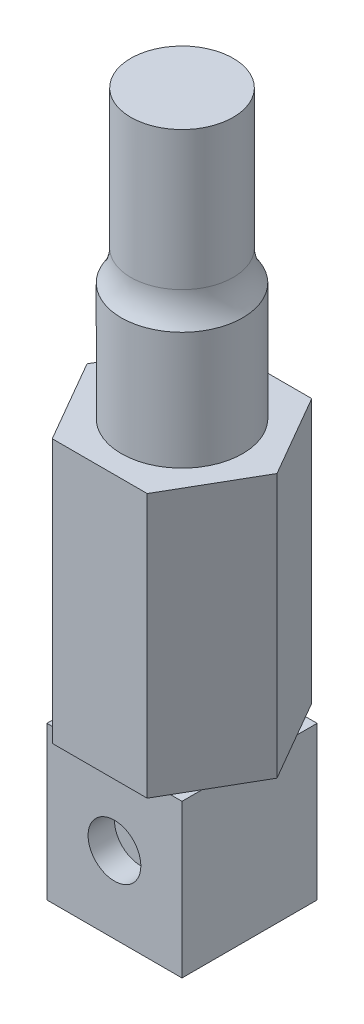
ISO-10303-21;
HEADER;
FILE_DESCRIPTION(('STEP AP214'),'2;1');
FILE_NAME('part.step','',(''),(''),'','','');
FILE_SCHEMA(('AUTOMOTIVE_DESIGN { 1 0 10303 214 1 1 1 1 }'));
ENDSEC;
DATA;
#1=APPLICATION_CONTEXT('core data for automotive mechanical design processes');
#2=APPLICATION_PROTOCOL_DEFINITION('international standard','automotive_design',2000,#1);
#3=PRODUCT_CONTEXT('',#1,'mechanical');
#4=PRODUCT('Part','Part','',(#3));
#5=PRODUCT_RELATED_PRODUCT_CATEGORY('part','',(#4));
#6=PRODUCT_DEFINITION_FORMATION('','',#4);
#7=PRODUCT_DEFINITION_CONTEXT('part definition',#1,'design');
#8=PRODUCT_DEFINITION('design','',#6,#7);
#9=PRODUCT_DEFINITION_SHAPE('','',#8);
#10=(LENGTH_UNIT() NAMED_UNIT(*) SI_UNIT(.MILLI.,.METRE.));
#11=(NAMED_UNIT(*) PLANE_ANGLE_UNIT() SI_UNIT($,.RADIAN.));
#12=(NAMED_UNIT(*) SI_UNIT($,.STERADIAN.) SOLID_ANGLE_UNIT());
#13=UNCERTAINTY_MEASURE_WITH_UNIT(LENGTH_MEASURE(1.E-05),#10,'distance_accuracy_value','');
#14=(GEOMETRIC_REPRESENTATION_CONTEXT(3) GLOBAL_UNCERTAINTY_ASSIGNED_CONTEXT((#13)) GLOBAL_UNIT_ASSIGNED_CONTEXT((#10,
#11,#12)) REPRESENTATION_CONTEXT('',''));
#15=CARTESIAN_POINT('',(0.,0.,0.));
#16=DIRECTION('',(0.,0.,1.));
#17=DIRECTION('',(1.,0.,0.));
#18=AXIS2_PLACEMENT_3D('',#15,#16,#17);
#19=CARTESIAN_POINT('',(0.,3.683,0.));
#20=DIRECTION('',(0.,-1.,0.));
#21=DIRECTION('',(0.,0.,-1.));
#22=AXIS2_PLACEMENT_3D('',#19,#20,#21);
#23=PLANE('',#22);
#24=DIRECTION('',(-0.499999999999999,0.,0.866025403784439));
#25=VECTOR('',#24,1.);
#26=CARTESIAN_POINT('',(-4.572,3.683,0.));
#27=LINE('',#26,#25);
#28=CARTESIAN_POINT('',(-2.69491880481069,3.683,-3.2512));
#29=VERTEX_POINT('',#28);
#30=CARTESIAN_POINT('',(-3.2512,3.683,-2.28769270663698));
#31=VERTEX_POINT('',#30);
#32=EDGE_CURVE('E367',#29,#31,#27,.T.);
#33=ORIENTED_EDGE('',*,*,#32,.F.);
#34=DIRECTION('',(-1.,0.,0.));
#35=VECTOR('',#34,1.);
#36=CARTESIAN_POINT('',(-3.2512,3.683,-3.2512));
#37=LINE('',#36,#35);
#38=CARTESIAN_POINT('',(-3.2512,3.683,-3.2512));
#39=VERTEX_POINT('',#38);
#40=EDGE_CURVE('E203',#29,#39,#37,.T.);
#41=ORIENTED_EDGE('',*,*,#40,.T.);
#42=DIRECTION('',(0.,0.,1.));
#43=VECTOR('',#42,1.);
#44=CARTESIAN_POINT('',(-3.2512,3.683,3.2512));
#45=LINE('',#44,#43);
#46=EDGE_CURVE('E212',#39,#31,#45,.T.);
#47=ORIENTED_EDGE('',*,*,#46,.T.);
#48=EDGE_LOOP('',(#33,#41,#47));
#49=FACE_BOUND('',#48,.T.);
#50=ADVANCED_FACE('F44',(#49),#23,.F.);
#51=DIRECTION('',(-0.5,0.,-0.866025403784439));
#52=VECTOR('',#51,1.);
#53=CARTESIAN_POINT('',(2.286,3.683,-3.95946814610245));
#54=LINE('',#53,#52);
#55=CARTESIAN_POINT('',(3.2512,3.683,-2.28769270663697));
#56=VERTEX_POINT('',#55);
#57=CARTESIAN_POINT('',(2.69491880481069,3.683,-3.2512));
#58=VERTEX_POINT('',#57);
#59=EDGE_CURVE('E351',#56,#58,#54,.T.);
#60=ORIENTED_EDGE('',*,*,#59,.F.);
#61=DIRECTION('',(0.,0.,-1.));
#62=VECTOR('',#61,1.);
#63=CARTESIAN_POINT('',(3.2512,3.683,3.2512));
#64=LINE('',#63,#62);
#65=CARTESIAN_POINT('',(3.2512,3.683,-3.2512));
#66=VERTEX_POINT('',#65);
#67=EDGE_CURVE('E205',#56,#66,#64,.T.);
#68=ORIENTED_EDGE('',*,*,#67,.T.);
#69=EDGE_CURVE('E206',#66,#58,#37,.T.);
#70=ORIENTED_EDGE('',*,*,#69,.T.);
#71=EDGE_LOOP('',(#60,#68,#70));
#72=FACE_BOUND('',#71,.T.);
#73=ADVANCED_FACE('F313',(#72),#23,.F.);
#74=DIRECTION('',(0.5,0.,-0.866025403784439));
#75=VECTOR('',#74,1.);
#76=CARTESIAN_POINT('',(4.572,3.683,0.));
#77=LINE('',#76,#75);
#78=CARTESIAN_POINT('',(2.69491880481069,3.683,3.2512));
#79=VERTEX_POINT('',#78);
#80=CARTESIAN_POINT('',(3.2512,3.683,2.28769270663698));
#81=VERTEX_POINT('',#80);
#82=EDGE_CURVE('E67',#79,#81,#77,.T.);
#83=ORIENTED_EDGE('',*,*,#82,.F.);
#84=DIRECTION('',(1.,0.,0.));
#85=VECTOR('',#84,1.);
#86=CARTESIAN_POINT('',(-3.2512,3.683,3.2512));
#87=LINE('',#86,#85);
#88=CARTESIAN_POINT('',(3.2512,3.683,3.2512));
#89=VERTEX_POINT('',#88);
#90=EDGE_CURVE('E216',#79,#89,#87,.T.);
#91=ORIENTED_EDGE('',*,*,#90,.T.);
#92=EDGE_CURVE('E200',#89,#81,#64,.T.);
#93=ORIENTED_EDGE('',*,*,#92,.T.);
#94=EDGE_LOOP('',(#83,#91,#93));
#95=FACE_BOUND('',#94,.T.);
#96=ADVANCED_FACE('F336',(#95),#23,.F.);
#97=DIRECTION('',(0.5,0.,0.866025403784438));
#98=VECTOR('',#97,1.);
#99=CARTESIAN_POINT('',(-2.286,3.683,3.95946814610246));
#100=LINE('',#99,#98);
#101=CARTESIAN_POINT('',(-3.2512,3.683,2.28769270663697));
#102=VERTEX_POINT('',#101);
#103=CARTESIAN_POINT('',(-2.69491880481069,3.683,3.2512));
#104=VERTEX_POINT('',#103);
#105=EDGE_CURVE('E75',#102,#104,#100,.T.);
#106=ORIENTED_EDGE('',*,*,#105,.F.);
#107=CARTESIAN_POINT('',(-3.2512,3.683,3.2512));
#108=VERTEX_POINT('',#107);
#109=EDGE_CURVE('E210',#102,#108,#45,.T.);
#110=ORIENTED_EDGE('',*,*,#109,.T.);
#111=EDGE_CURVE('E218',#108,#104,#87,.T.);
#112=ORIENTED_EDGE('',*,*,#111,.T.);
#113=EDGE_LOOP('',(#106,#110,#112));
#114=FACE_BOUND('',#113,.T.);
#115=ADVANCED_FACE('F315',(#114),#23,.F.);
#116=CARTESIAN_POINT('',(3.2512,3.683,3.2512));
#117=DIRECTION('',(-1.,0.,0.));
#118=DIRECTION('',(0.,0.,1.));
#119=AXIS2_PLACEMENT_3D('',#116,#117,#118);
#120=PLANE('',#119);
#121=DIRECTION('',(0.,0.,-1.));
#122=VECTOR('',#121,1.);
#123=CARTESIAN_POINT('',(3.2512,-3.683,3.2512));
#124=LINE('',#123,#122);
#125=CARTESIAN_POINT('',(3.2512,-3.683,3.2512));
#126=VERTEX_POINT('',#125);
#127=CARTESIAN_POINT('',(3.2512,-3.683,-3.2512));
#128=VERTEX_POINT('',#127);
#129=EDGE_CURVE('E198',#126,#128,#124,.T.);
#130=ORIENTED_EDGE('',*,*,#129,.T.);
#131=DIRECTION('',(0.,-1.,0.));
#132=VECTOR('',#131,1.);
#133=CARTESIAN_POINT('',(3.2512,3.683,-3.2512));
#134=LINE('',#133,#132);
#135=EDGE_CURVE('E246',#66,#128,#134,.T.);
#136=ORIENTED_EDGE('',*,*,#135,.F.);
#137=ORIENTED_EDGE('',*,*,#67,.F.);
#138=EDGE_CURVE('E204',#81,#56,#64,.T.);
#139=ORIENTED_EDGE('',*,*,#138,.F.);
#140=ORIENTED_EDGE('',*,*,#92,.F.);
#141=DIRECTION('',(0.,-1.,0.));
#142=VECTOR('',#141,1.);
#143=CARTESIAN_POINT('',(3.2512,3.683,3.2512));
#144=LINE('',#143,#142);
#145=EDGE_CURVE('E221',#89,#126,#144,.T.);
#146=ORIENTED_EDGE('',*,*,#145,.T.);
#147=EDGE_LOOP('',(#130,#136,#137,#139,#140,#146));
#148=FACE_BOUND('',#147,.T.);
#149=ADVANCED_FACE('F329',(#148),#120,.F.);
#150=CARTESIAN_POINT('',(-3.2512,3.683,-3.2512));
#151=DIRECTION('',(0.,0.,1.));
#152=DIRECTION('',(1.,0.,0.));
#153=AXIS2_PLACEMENT_3D('',#150,#151,#152);
#154=PLANE('',#153);
#155=DIRECTION('',(-1.,0.,0.));
#156=VECTOR('',#155,1.);
#157=CARTESIAN_POINT('',(-3.2512,-3.683,-3.2512));
#158=LINE('',#157,#156);
#159=CARTESIAN_POINT('',(-3.2512,-3.683,-3.2512));
#160=VERTEX_POINT('',#159);
#161=EDGE_CURVE('E226',#128,#160,#158,.T.);
#162=ORIENTED_EDGE('',*,*,#161,.T.);
#163=DIRECTION('',(0.,-1.,0.));
#164=VECTOR('',#163,1.);
#165=CARTESIAN_POINT('',(-3.2512,3.683,-3.2512));
#166=LINE('',#165,#164);
#167=EDGE_CURVE('E242',#39,#160,#166,.T.);
#168=ORIENTED_EDGE('',*,*,#167,.F.);
#169=ORIENTED_EDGE('',*,*,#40,.F.);
#170=EDGE_CURVE('E211',#58,#29,#37,.T.);
#171=ORIENTED_EDGE('',*,*,#170,.F.);
#172=ORIENTED_EDGE('',*,*,#69,.F.);
#173=ORIENTED_EDGE('',*,*,#135,.T.);
#174=EDGE_LOOP('',(#162,#168,#169,#171,#172,#173));
#175=FACE_BOUND('',#174,.T.);
#176=ADVANCED_FACE('F326',(#175),#154,.F.);
#177=CARTESIAN_POINT('',(-3.2512,3.683,3.2512));
#178=DIRECTION('',(1.,0.,0.));
#179=DIRECTION('',(0.,0.,-1.));
#180=AXIS2_PLACEMENT_3D('',#177,#178,#179);
#181=PLANE('',#180);
#182=DIRECTION('',(0.,0.,1.));
#183=VECTOR('',#182,1.);
#184=CARTESIAN_POINT('',(-3.2512,-3.683,3.2512));
#185=LINE('',#184,#183);
#186=CARTESIAN_POINT('',(-3.2512,-3.683,3.2512));
#187=VERTEX_POINT('',#186);
#188=EDGE_CURVE('E229',#160,#187,#185,.T.);
#189=ORIENTED_EDGE('',*,*,#188,.T.);
#190=DIRECTION('',(0.,-1.,0.));
#191=VECTOR('',#190,1.);
#192=CARTESIAN_POINT('',(-3.2512,3.683,3.2512));
#193=LINE('',#192,#191);
#194=EDGE_CURVE('E238',#108,#187,#193,.T.);
#195=ORIENTED_EDGE('',*,*,#194,.F.);
#196=ORIENTED_EDGE('',*,*,#109,.F.);
#197=EDGE_CURVE('E217',#31,#102,#45,.T.);
#198=ORIENTED_EDGE('',*,*,#197,.F.);
#199=ORIENTED_EDGE('',*,*,#46,.F.);
#200=ORIENTED_EDGE('',*,*,#167,.T.);
#201=EDGE_LOOP('',(#189,#195,#196,#198,#199,#200));
#202=FACE_BOUND('',#201,.T.);
#203=ADVANCED_FACE('F322',(#202),#181,.F.);
#204=CARTESIAN_POINT('',(-3.2512,3.683,3.2512));
#205=DIRECTION('',(0.,0.,-1.));
#206=DIRECTION('',(-1.,0.,0.));
#207=AXIS2_PLACEMENT_3D('',#204,#205,#206);
#208=PLANE('',#207);
#209=CARTESIAN_POINT('',(0.,0.,3.2512));
#210=DIRECTION('',(0.,0.,1.));
#211=DIRECTION('',(1.,0.,0.));
#212=AXIS2_PLACEMENT_3D('',#209,#210,#211);
#213=CIRCLE('',#212,1.27);
#214=CARTESIAN_POINT('',(1.27,0.,3.2512));
#215=VERTEX_POINT('',#214);
#216=EDGE_CURVE('E185',#215,#215,#213,.T.);
#217=ORIENTED_EDGE('',*,*,#216,.F.);
#218=EDGE_LOOP('',(#217));
#219=FACE_BOUND('',#218,.T.);
#220=DIRECTION('',(1.,0.,0.));
#221=VECTOR('',#220,1.);
#222=CARTESIAN_POINT('',(-3.2512,-3.683,3.2512));
#223=LINE('',#222,#221);
#224=EDGE_CURVE('E232',#187,#126,#223,.T.);
#225=ORIENTED_EDGE('',*,*,#224,.T.);
#226=ORIENTED_EDGE('',*,*,#145,.F.);
#227=ORIENTED_EDGE('',*,*,#90,.F.);
#228=EDGE_CURVE('E222',#104,#79,#87,.T.);
#229=ORIENTED_EDGE('',*,*,#228,.F.);
#230=ORIENTED_EDGE('',*,*,#111,.F.);
#231=ORIENTED_EDGE('',*,*,#194,.T.);
#232=EDGE_LOOP('',(#225,#226,#227,#229,#230,#231));
#233=FACE_BOUND('',#232,.T.);
#234=ADVANCED_FACE('F318',(#219,#233),#208,.F.);
#235=CARTESIAN_POINT('',(0.,-3.683,0.));
#236=DIRECTION('',(0.,-1.,0.));
#237=DIRECTION('',(0.,0.,-1.));
#238=AXIS2_PLACEMENT_3D('',#235,#236,#237);
#239=PLANE('',#238);
#240=ORIENTED_EDGE('',*,*,#129,.F.);
#241=ORIENTED_EDGE('',*,*,#224,.F.);
#242=ORIENTED_EDGE('',*,*,#188,.F.);
#243=ORIENTED_EDGE('',*,*,#161,.F.);
#244=EDGE_LOOP('',(#240,#241,#242,#243));
#245=FACE_BOUND('',#244,.T.);
#246=ADVANCED_FACE('F309',(#245),#239,.T.);
#247=CARTESIAN_POINT('',(0.,0.,1.9812));
#248=DIRECTION('',(0.,0.,1.));
#249=DIRECTION('',(1.,0.,0.));
#250=AXIS2_PLACEMENT_3D('',#247,#248,#249);
#251=CYLINDRICAL_SURFACE('',#250,1.27);
#252=CARTESIAN_POINT('',(0.,0.,1.9812));
#253=DIRECTION('',(0.,0.,1.));
#254=DIRECTION('',(1.,0.,0.));
#255=AXIS2_PLACEMENT_3D('',#252,#253,#254);
#256=CIRCLE('',#255,1.27);
#257=CARTESIAN_POINT('',(1.27,0.,1.9812));
#258=VERTEX_POINT('',#257);
#259=EDGE_CURVE('E190',#258,#258,#256,.T.);
#260=ORIENTED_EDGE('',*,*,#259,.F.);
#261=EDGE_LOOP('',(#260));
#262=FACE_BOUND('',#261,.T.);
#263=ORIENTED_EDGE('',*,*,#216,.T.);
#264=EDGE_LOOP('',(#263));
#265=FACE_BOUND('',#264,.T.);
#266=ADVANCED_FACE('F305',(#262,#265),#251,.F.);
#267=CARTESIAN_POINT('',(0.,0.,1.9812));
#268=DIRECTION('',(0.,0.,1.));
#269=DIRECTION('',(1.,0.,0.));
#270=AXIS2_PLACEMENT_3D('',#267,#268,#269);
#271=PLANE('',#270);
#272=ORIENTED_EDGE('',*,*,#259,.T.);
#273=EDGE_LOOP('',(#272));
#274=FACE_BOUND('',#273,.T.);
#275=ADVANCED_FACE('F302',(#274),#271,.T.);
#276=CARTESIAN_POINT('',(0.,3.683,0.));
#277=DIRECTION('',(0.,-1.,0.));
#278=DIRECTION('',(0.,0.,-1.));
#279=AXIS2_PLACEMENT_3D('',#276,#277,#278);
#280=PLANE('',#279);
#281=CARTESIAN_POINT('',(4.572,3.683,0.));
#282=VERTEX_POINT('',#281);
#283=EDGE_CURVE('E373',#81,#282,#77,.T.);
#284=ORIENTED_EDGE('',*,*,#283,.F.);
#285=ORIENTED_EDGE('',*,*,#138,.T.);
#286=EDGE_CURVE('E360',#282,#56,#54,.T.);
#287=ORIENTED_EDGE('',*,*,#286,.F.);
#288=EDGE_LOOP('',(#284,#285,#287));
#289=FACE_BOUND('',#288,.T.);
#290=ADVANCED_FACE('F281',(#289),#280,.T.);
#291=CARTESIAN_POINT('',(2.286,3.683,-3.95946814610245));
#292=VERTEX_POINT('',#291);
#293=EDGE_CURVE('E354',#58,#292,#54,.T.);
#294=ORIENTED_EDGE('',*,*,#293,.F.);
#295=ORIENTED_EDGE('',*,*,#170,.T.);
#296=CARTESIAN_POINT('',(-2.286,3.683,-3.95946814610245));
#297=VERTEX_POINT('',#296);
#298=EDGE_CURVE('E371',#297,#29,#27,.T.);
#299=ORIENTED_EDGE('',*,*,#298,.F.);
#300=DIRECTION('',(-1.,0.,0.));
#301=VECTOR('',#300,1.);
#302=CARTESIAN_POINT('',(-2.286,3.683,-3.95946814610245));
#303=LINE('',#302,#301);
#304=EDGE_CURVE('E176',#292,#297,#303,.T.);
#305=ORIENTED_EDGE('',*,*,#304,.F.);
#306=EDGE_LOOP('',(#294,#295,#299,#305));
#307=FACE_BOUND('',#306,.T.);
#308=ADVANCED_FACE('F355',(#307),#280,.T.);
#309=CARTESIAN_POINT('',(-4.572,3.683,0.));
#310=VERTEX_POINT('',#309);
#311=EDGE_CURVE('E182',#31,#310,#27,.T.);
#312=ORIENTED_EDGE('',*,*,#311,.F.);
#313=ORIENTED_EDGE('',*,*,#197,.T.);
#314=EDGE_CURVE('E404',#310,#102,#100,.T.);
#315=ORIENTED_EDGE('',*,*,#314,.F.);
#316=EDGE_LOOP('',(#312,#313,#315));
#317=FACE_BOUND('',#316,.T.);
#318=ADVANCED_FACE('F282',(#317),#280,.T.);
#319=CARTESIAN_POINT('',(-4.572,16.383,0.));
#320=DIRECTION('',(0.866025403784439,0.,0.499999999999999));
#321=DIRECTION('',(0.499999999999999,0.,-0.866025403784439));
#322=AXIS2_PLACEMENT_3D('',#319,#320,#321);
#323=PLANE('',#322);
#324=ORIENTED_EDGE('',*,*,#298,.T.);
#325=ORIENTED_EDGE('',*,*,#32,.T.);
#326=ORIENTED_EDGE('',*,*,#311,.T.);
#327=DIRECTION('',(0.,-1.,0.));
#328=VECTOR('',#327,1.);
#329=CARTESIAN_POINT('',(-4.572,16.383,0.));
#330=LINE('',#329,#328);
#331=CARTESIAN_POINT('',(-4.572,16.383,0.));
#332=VERTEX_POINT('',#331);
#333=EDGE_CURVE('E159',#332,#310,#330,.T.);
#334=ORIENTED_EDGE('',*,*,#333,.F.);
#335=DIRECTION('',(-0.499999999999999,0.,0.866025403784439));
#336=VECTOR('',#335,1.);
#337=CARTESIAN_POINT('',(-4.572,16.383,0.));
#338=LINE('',#337,#336);
#339=CARTESIAN_POINT('',(-2.286,16.383,-3.95946814610245));
#340=VERTEX_POINT('',#339);
#341=EDGE_CURVE('E166',#340,#332,#338,.T.);
#342=ORIENTED_EDGE('',*,*,#341,.F.);
#343=DIRECTION('',(0.,-1.,0.));
#344=VECTOR('',#343,1.);
#345=CARTESIAN_POINT('',(-2.286,16.383,-3.95946814610245));
#346=LINE('',#345,#344);
#347=EDGE_CURVE('E378',#340,#297,#346,.T.);
#348=ORIENTED_EDGE('',*,*,#347,.T.);
#349=EDGE_LOOP('',(#324,#325,#326,#334,#342,#348));
#350=FACE_BOUND('',#349,.T.);
#351=ADVANCED_FACE('F179',(#350),#323,.F.);
#352=CARTESIAN_POINT('',(-2.286,16.383,3.95946814610246));
#353=DIRECTION('',(0.866025403784438,0.,-0.5));
#354=DIRECTION('',(-0.500000000000001,0.,-0.866025403784438));
#355=AXIS2_PLACEMENT_3D('',#352,#353,#354);
#356=PLANE('',#355);
#357=ORIENTED_EDGE('',*,*,#314,.T.);
#358=ORIENTED_EDGE('',*,*,#105,.T.);
#359=CARTESIAN_POINT('',(-2.286,3.683,3.95946814610246));
#360=VERTEX_POINT('',#359);
#361=EDGE_CURVE('E406',#104,#360,#100,.T.);
#362=ORIENTED_EDGE('',*,*,#361,.T.);
#363=DIRECTION('',(0.,-1.,0.));
#364=VECTOR('',#363,1.);
#365=CARTESIAN_POINT('',(-2.286,16.383,3.95946814610246));
#366=LINE('',#365,#364);
#367=CARTESIAN_POINT('',(-2.286,16.383,3.95946814610246));
#368=VERTEX_POINT('',#367);
#369=EDGE_CURVE('E161',#368,#360,#366,.T.);
#370=ORIENTED_EDGE('',*,*,#369,.F.);
#371=DIRECTION('',(0.5,0.,0.866025403784438));
#372=VECTOR('',#371,1.);
#373=CARTESIAN_POINT('',(-2.286,16.383,3.95946814610246));
#374=LINE('',#373,#372);
#375=EDGE_CURVE('E154',#332,#368,#374,.T.);
#376=ORIENTED_EDGE('',*,*,#375,.F.);
#377=ORIENTED_EDGE('',*,*,#333,.T.);
#378=EDGE_LOOP('',(#357,#358,#362,#370,#376,#377));
#379=FACE_BOUND('',#378,.T.);
#380=ADVANCED_FACE('F157',(#379),#356,.F.);
#381=CARTESIAN_POINT('',(2.286,16.383,3.95946814610245));
#382=DIRECTION('',(0.,0.,-1.));
#383=DIRECTION('',(-1.,0.,0.));
#384=AXIS2_PLACEMENT_3D('',#381,#382,#383);
#385=PLANE('',#384);
#386=DIRECTION('',(1.,0.,0.));
#387=VECTOR('',#386,1.);
#388=CARTESIAN_POINT('',(2.286,3.683,3.95946814610245));
#389=LINE('',#388,#387);
#390=CARTESIAN_POINT('',(2.286,3.683,3.95946814610245));
#391=VERTEX_POINT('',#390);
#392=EDGE_CURVE('E397',#360,#391,#389,.T.);
#393=ORIENTED_EDGE('',*,*,#392,.T.);
#394=DIRECTION('',(0.,-1.,0.));
#395=VECTOR('',#394,1.);
#396=CARTESIAN_POINT('',(2.286,16.383,3.95946814610245));
#397=LINE('',#396,#395);
#398=CARTESIAN_POINT('',(2.286,16.383,3.95946814610245));
#399=VERTEX_POINT('',#398);
#400=EDGE_CURVE('E192',#399,#391,#397,.T.);
#401=ORIENTED_EDGE('',*,*,#400,.F.);
#402=DIRECTION('',(1.,0.,0.));
#403=VECTOR('',#402,1.);
#404=CARTESIAN_POINT('',(2.286,16.383,3.95946814610245));
#405=LINE('',#404,#403);
#406=EDGE_CURVE('E165',#368,#399,#405,.T.);
#407=ORIENTED_EDGE('',*,*,#406,.F.);
#408=ORIENTED_EDGE('',*,*,#369,.T.);
#409=EDGE_LOOP('',(#393,#401,#407,#408));
#410=FACE_BOUND('',#409,.T.);
#411=ADVANCED_FACE('F293',(#410),#385,.F.);
#412=CARTESIAN_POINT('',(4.572,16.383,0.));
#413=DIRECTION('',(-0.866025403784439,0.,-0.5));
#414=DIRECTION('',(-0.5,0.,0.866025403784439));
#415=AXIS2_PLACEMENT_3D('',#412,#413,#414);
#416=PLANE('',#415);
#417=EDGE_CURVE('E361',#391,#79,#77,.T.);
#418=ORIENTED_EDGE('',*,*,#417,.T.);
#419=ORIENTED_EDGE('',*,*,#82,.T.);
#420=ORIENTED_EDGE('',*,*,#283,.T.);
#421=DIRECTION('',(0.,-1.,0.));
#422=VECTOR('',#421,1.);
#423=CARTESIAN_POINT('',(4.572,16.383,0.));
#424=LINE('',#423,#422);
#425=CARTESIAN_POINT('',(4.572,16.383,0.));
#426=VERTEX_POINT('',#425);
#427=EDGE_CURVE('E384',#426,#282,#424,.T.);
#428=ORIENTED_EDGE('',*,*,#427,.F.);
#429=DIRECTION('',(0.5,0.,-0.866025403784439));
#430=VECTOR('',#429,1.);
#431=CARTESIAN_POINT('',(4.572,16.383,0.));
#432=LINE('',#431,#430);
#433=EDGE_CURVE('E393',#399,#426,#432,.T.);
#434=ORIENTED_EDGE('',*,*,#433,.F.);
#435=ORIENTED_EDGE('',*,*,#400,.T.);
#436=EDGE_LOOP('',(#418,#419,#420,#428,#434,#435));
#437=FACE_BOUND('',#436,.T.);
#438=ADVANCED_FACE('F289',(#437),#416,.F.);
#439=CARTESIAN_POINT('',(2.286,16.383,-3.95946814610245));
#440=DIRECTION('',(-0.866025403784438,0.,0.5));
#441=DIRECTION('',(0.5,0.,0.866025403784439));
#442=AXIS2_PLACEMENT_3D('',#439,#440,#441);
#443=PLANE('',#442);
#444=ORIENTED_EDGE('',*,*,#286,.T.);
#445=ORIENTED_EDGE('',*,*,#59,.T.);
#446=ORIENTED_EDGE('',*,*,#293,.T.);
#447=DIRECTION('',(0.,-1.,0.));
#448=VECTOR('',#447,1.);
#449=CARTESIAN_POINT('',(2.286,16.383,-3.95946814610245));
#450=LINE('',#449,#448);
#451=CARTESIAN_POINT('',(2.286,16.383,-3.95946814610245));
#452=VERTEX_POINT('',#451);
#453=EDGE_CURVE('E381',#452,#292,#450,.T.);
#454=ORIENTED_EDGE('',*,*,#453,.F.);
#455=DIRECTION('',(-0.5,0.,-0.866025403784439));
#456=VECTOR('',#455,1.);
#457=CARTESIAN_POINT('',(2.286,16.383,-3.95946814610245));
#458=LINE('',#457,#456);
#459=EDGE_CURVE('E411',#426,#452,#458,.T.);
#460=ORIENTED_EDGE('',*,*,#459,.F.);
#461=ORIENTED_EDGE('',*,*,#427,.T.);
#462=EDGE_LOOP('',(#444,#445,#446,#454,#460,#461));
#463=FACE_BOUND('',#462,.T.);
#464=ADVANCED_FACE('F285',(#463),#443,.F.);
#465=CARTESIAN_POINT('',(-2.286,16.383,-3.95946814610245));
#466=DIRECTION('',(0.,0.,1.));
#467=DIRECTION('',(1.,0.,0.));
#468=AXIS2_PLACEMENT_3D('',#465,#466,#467);
#469=PLANE('',#468);
#470=ORIENTED_EDGE('',*,*,#304,.T.);
#471=ORIENTED_EDGE('',*,*,#347,.F.);
#472=DIRECTION('',(-1.,0.,0.));
#473=VECTOR('',#472,1.);
#474=CARTESIAN_POINT('',(-2.286,16.383,-3.95946814610245));
#475=LINE('',#474,#473);
#476=EDGE_CURVE('E171',#452,#340,#475,.T.);
#477=ORIENTED_EDGE('',*,*,#476,.F.);
#478=ORIENTED_EDGE('',*,*,#453,.T.);
#479=EDGE_LOOP('',(#470,#471,#477,#478));
#480=FACE_BOUND('',#479,.T.);
#481=ADVANCED_FACE('F276',(#480),#469,.F.);
#482=CARTESIAN_POINT('',(0.,16.383,0.));
#483=DIRECTION('',(0.,-1.,0.));
#484=DIRECTION('',(0.,0.,-1.));
#485=AXIS2_PLACEMENT_3D('',#482,#483,#484);
#486=PLANE('',#485);
#487=CARTESIAN_POINT('',(0.,16.383,0.));
#488=DIRECTION('',(0.,1.,0.));
#489=DIRECTION('',(0.,0.,1.));
#490=AXIS2_PLACEMENT_3D('',#487,#488,#489);
#491=CIRCLE('',#490,2.921);
#492=CARTESIAN_POINT('',(0.,16.383,2.921));
#493=VERTEX_POINT('',#492);
#494=EDGE_CURVE('E60',#493,#493,#491,.T.);
#495=ORIENTED_EDGE('',*,*,#494,.F.);
#496=EDGE_LOOP('',(#495));
#497=FACE_BOUND('',#496,.T.);
#498=ORIENTED_EDGE('',*,*,#341,.T.);
#499=ORIENTED_EDGE('',*,*,#375,.T.);
#500=ORIENTED_EDGE('',*,*,#406,.T.);
#501=ORIENTED_EDGE('',*,*,#433,.T.);
#502=ORIENTED_EDGE('',*,*,#459,.T.);
#503=ORIENTED_EDGE('',*,*,#476,.T.);
#504=EDGE_LOOP('',(#498,#499,#500,#501,#502,#503));
#505=FACE_BOUND('',#504,.T.);
#506=ADVANCED_FACE('F169',(#497,#505),#486,.F.);
#507=ORIENTED_EDGE('',*,*,#361,.F.);
#508=ORIENTED_EDGE('',*,*,#228,.T.);
#509=ORIENTED_EDGE('',*,*,#417,.F.);
#510=ORIENTED_EDGE('',*,*,#392,.F.);
#511=EDGE_LOOP('',(#507,#508,#509,#510));
#512=FACE_BOUND('',#511,.T.);
#513=ADVANCED_FACE('F272',(#512),#280,.T.);
#514=CARTESIAN_POINT('',(0.,22.0472,0.));
#515=DIRECTION('',(0.,-1.,0.));
#516=DIRECTION('',(0.,0.,-1.));
#517=AXIS2_PLACEMENT_3D('',#514,#515,#516);
#518=CYLINDRICAL_SURFACE('',#517,2.921);
#519=CARTESIAN_POINT('',(0.,22.0472000000004,2.92100000000056));
#520=CARTESIAN_POINT('',(0.382358003335548,22.0472000000004,2.92100000000056));
#521=CARTESIAN_POINT('',(0.764565572565215,22.0472000000004,2.84497418757509));
#522=CARTESIAN_POINT('',(1.47107103931208,22.0472000000004,2.55233004135688));
#523=CARTESIAN_POINT('',(1.79509097084635,22.0472000000004,2.33582684484526));
#524=CARTESIAN_POINT('',(2.33582684484625,22.0472000000004,1.79509097084735));
#525=CARTESIAN_POINT('',(2.55233004135772,22.0472000000004,1.47107103931247));
#526=CARTESIAN_POINT('',(2.84497418757426,22.0472000000004,0.764565572564819));
#527=CARTESIAN_POINT('',(2.9210000000007,22.0472000000004,0.382358003335548));
#528=CARTESIAN_POINT('',(2.92100000000042,22.0472000000004,-0.382358003335548));
#529=CARTESIAN_POINT('',(2.84497418757426,22.0472000000004,-0.764565572564818));
#530=CARTESIAN_POINT('',(2.55233004135772,22.0472000000004,-1.47107103931246));
#531=CARTESIAN_POINT('',(2.33582684484541,22.0472000000004,-1.79509097084706));
#532=CARTESIAN_POINT('',(1.7950909708472,22.0472000000004,-2.33582684484555));
#533=CARTESIAN_POINT('',(1.47107103931241,22.0472000000004,-2.55233004135766));
#534=CARTESIAN_POINT('',(0.764565572564872,22.0472000000004,-2.84497418757432));
#535=CARTESIAN_POINT('',(0.382358003335894,22.0472000000004,-2.92100000000056));
#536=CARTESIAN_POINT('',(-0.382358003335894,22.0472000000004,-2.92100000000056));
#537=CARTESIAN_POINT('',(-0.764565572564872,22.0472000000004,-2.84497418757489));
#538=CARTESIAN_POINT('',(-1.47107103931241,22.0472000000004,-2.55233004135709));
#539=CARTESIAN_POINT('',(-1.79509097084663,22.0472000000004,-2.33582684484583));
#540=CARTESIAN_POINT('',(-2.33582684484597,22.0472000000004,-1.79509097084677));
#541=CARTESIAN_POINT('',(-2.55233004135772,22.0472000000004,-1.47107103931247));
#542=CARTESIAN_POINT('',(-2.84497418757426,22.0472000000004,-0.764565572564819));
#543=CARTESIAN_POINT('',(-2.92100000000056,22.0472000000004,-0.382358003335125));
#544=CARTESIAN_POINT('',(-2.92100000000056,22.0472000000004,0.382358003335121));
#545=CARTESIAN_POINT('',(-2.84497418757468,22.0472000000004,0.76456557256539));
#546=CARTESIAN_POINT('',(-2.55233004135729,22.0472000000004,1.4710710393119));
#547=CARTESIAN_POINT('',(-2.33582684484554,22.0472000000004,1.7950909708465));
#548=CARTESIAN_POINT('',(-1.79509097084707,22.0472000000004,2.33582684484611));
#549=CARTESIAN_POINT('',(-1.47107103931178,22.0472000000004,2.55233004135703));
#550=CARTESIAN_POINT('',(-0.764565572565491,22.0472000000004,2.84497418757495));
#551=CARTESIAN_POINT('',(-0.382358003335548,22.0472000000004,2.92100000000056));
#552=CARTESIAN_POINT('',(0.,22.0472000000004,2.92100000000056));
#553=(BOUNDED_CURVE() B_SPLINE_CURVE(3,(#519,#520,#521,#522,#523,#524,#525,#526,#527,#528,#529,
#530,#531,#532,#533,#534,#535,#536,#537,#538,#539,#540,#541,#542,#543,#544,#545,#546,#547,#548,
#549,#550,#551,#552),.UNSPECIFIED.,.T.,.F.) B_SPLINE_CURVE_WITH_KNOTS((4,2,2,2,2,2,2,2,2,2,2,2,
2,2,2,2,4),(-3.14159265358979,-2.74889357189107,-2.35619449019234,-1.96349540849362,
-1.5707963267949,-1.17809724509617,-0.785398163397448,-0.392699081698724,0.,0.392699081698724,
0.785398163397448,1.17809724509617,1.5707963267949,1.96349540849362,2.35619449019234,
2.74889357189107,3.14159265358979),
.UNSPECIFIED.) CURVE() GEOMETRIC_REPRESENTATION_ITEM() RATIONAL_B_SPLINE_CURVE((1.,1.,1.,1.,1.,
1.,1.,1.,1.,1.,1.,1.,1.,1.,1.,1.,1.,1.,1.,1.,1.,1.,1.,1.,1.,1.,1.,1.,1.,1.,1.,1.,1.,1.)) REPRESENTATION_ITEM(''));
#554=CARTESIAN_POINT('',(0.,22.0472000000004,2.92100000000056));
#555=VERTEX_POINT('',#554);
#556=EDGE_CURVE('E424',#555,#555,#553,.T.);
#557=ORIENTED_EDGE('',*,*,#556,.F.);
#558=EDGE_LOOP('',(#557));
#559=FACE_BOUND('',#558,.T.);
#560=ORIENTED_EDGE('',*,*,#494,.T.);
#561=EDGE_LOOP('',(#560));
#562=FACE_BOUND('',#561,.T.);
#563=ADVANCED_FACE('F268',(#559,#562),#518,.T.);
#564=CARTESIAN_POINT('',(0.,30.1752,0.));
#565=DIRECTION('',(0.,-1.,0.));
#566=DIRECTION('',(0.,0.,-1.));
#567=AXIS2_PLACEMENT_3D('',#564,#565,#566);
#568=CYLINDRICAL_SURFACE('',#567,2.4638);
#569=CARTESIAN_POINT('',(0.,23.5010033429606,2.4638));
#570=CARTESIAN_POINT('',(-0.322510663682965,23.5010033429606,2.4638));
#571=CARTESIAN_POINT('',(-0.644894439468077,23.5010033429618,2.39967387995373));
#572=CARTESIAN_POINT('',(-1.24081644185413,23.5010033429595,2.15283490444889));
#573=CARTESIAN_POINT('',(-1.51412021019219,23.5010033429618,1.97021916478264));
#574=CARTESIAN_POINT('',(-1.97021916478264,23.5010033429595,1.51412021019219));
#575=CARTESIAN_POINT('',(-2.15283490444885,23.5010033429606,1.24081644185423));
#576=CARTESIAN_POINT('',(-2.39967387995376,23.5010033429606,0.644894439467996));
#577=CARTESIAN_POINT('',(-2.4638,23.5010033429606,0.322510663682605));
#578=CARTESIAN_POINT('',(-2.4638,23.5010033429606,-0.322510663682609));
#579=CARTESIAN_POINT('',(-2.39967387995384,23.5010033429595,-0.6448944394678));
#580=CARTESIAN_POINT('',(-2.15283490444877,23.5010033429618,-1.24081644185441));
#581=CARTESIAN_POINT('',(-1.9702191647828,23.5010033429606,-1.51412021019203));
#582=CARTESIAN_POINT('',(-1.51412021019203,23.5010033429606,-1.9702191647828));
#583=CARTESIAN_POINT('',(-1.24081644185462,23.5010033429606,-2.15283490444869));
#584=CARTESIAN_POINT('',(-0.644894439467592,23.5010033429606,-2.39967387995393));
#585=CARTESIAN_POINT('',(-0.322510663683257,23.5010033429606,-2.4638));
#586=CARTESIAN_POINT('',(0.322510663683257,23.5010033429606,-2.4638));
#587=CARTESIAN_POINT('',(0.644894439467836,23.5010033429595,-2.39967387995383));
#588=CARTESIAN_POINT('',(1.24081644185438,23.5010033429618,-2.15283490444879));
#589=CARTESIAN_POINT('',(1.51412021019235,23.5010033429606,-1.97021916478248));
#590=CARTESIAN_POINT('',(1.97021916478248,23.5010033429606,-1.51412021019235));
#591=CARTESIAN_POINT('',(2.15283490444875,23.5010033429618,-1.24081644185448));
#592=CARTESIAN_POINT('',(2.39967387995387,23.5010033429595,-0.644894439467729));
#593=CARTESIAN_POINT('',(2.4638,23.5010033429606,-0.322510663682965));
#594=CARTESIAN_POINT('',(2.4638,23.5010033429606,0.322510663682965));
#595=CARTESIAN_POINT('',(2.39967387995384,23.5010033429595,0.644894439467801));
#596=CARTESIAN_POINT('',(2.15283490444877,23.5010033429618,1.24081644185442));
#597=CARTESIAN_POINT('',(1.97021916478267,23.5010033429618,1.51412021019216));
#598=CARTESIAN_POINT('',(1.51412021019216,23.5010033429595,1.97021916478267));
#599=CARTESIAN_POINT('',(1.24081644185434,23.5010033429595,2.1528349044488));
#600=CARTESIAN_POINT('',(0.644894439467883,23.5010033429618,2.39967387995381));
#601=CARTESIAN_POINT('',(0.322510663682966,23.5010033429606,2.4638));
#602=CARTESIAN_POINT('',(0.,23.5010033429606,2.4638));
#603=(BOUNDED_CURVE() B_SPLINE_CURVE(3,(#569,#570,#571,#572,#573,#574,#575,#576,#577,#578,#579,
#580,#581,#582,#583,#584,#585,#586,#587,#588,#589,#590,#591,#592,#593,#594,#595,#596,#597,#598,
#599,#600,#601,#602),.UNSPECIFIED.,.T.,.F.) B_SPLINE_CURVE_WITH_KNOTS((4,2,2,2,2,2,2,2,2,2,2,2,
2,2,2,2,4),(-3.14159265358979,-2.74889357189107,-2.35619449019234,-1.96349540849362,
-1.5707963267949,-1.17809724509617,-0.785398163397448,-0.392699081698724,0.,0.392699081698724,
0.785398163397448,1.17809724509617,1.5707963267949,1.96349540849362,2.35619449019234,
2.74889357189107,3.14159265358979),
.UNSPECIFIED.) CURVE() GEOMETRIC_REPRESENTATION_ITEM() RATIONAL_B_SPLINE_CURVE((1.,1.,1.,1.,1.,
1.,1.,1.,1.,1.,1.,1.,1.,1.,1.,1.,1.,1.,1.,1.,1.,1.,1.,1.,1.,1.,1.,1.,1.,1.,1.,1.,1.,1.)) REPRESENTATION_ITEM(''));
#604=CARTESIAN_POINT('',(0.,23.5010033429606,2.4638));
#605=VERTEX_POINT('',#604);
#606=EDGE_CURVE('E12',#605,#605,#603,.F.);
#607=ORIENTED_EDGE('',*,*,#606,.T.);
#608=EDGE_LOOP('',(#607));
#609=FACE_BOUND('',#608,.T.);
#610=CARTESIAN_POINT('',(0.,30.1752,0.));
#611=DIRECTION('',(0.,1.,0.));
#612=DIRECTION('',(0.,0.,1.));
#613=AXIS2_PLACEMENT_3D('',#610,#611,#612);
#614=CIRCLE('',#613,2.4638);
#615=CARTESIAN_POINT('',(0.,30.1752,2.4638));
#616=VERTEX_POINT('',#615);
#617=EDGE_CURVE('E421',#616,#616,#614,.T.);
#618=ORIENTED_EDGE('',*,*,#617,.F.);
#619=EDGE_LOOP('',(#618));
#620=FACE_BOUND('',#619,.T.);
#621=ADVANCED_FACE('F258',(#609,#620),#568,.T.);
#622=CARTESIAN_POINT('',(0.,30.1752,0.));
#623=DIRECTION('',(0.,1.,0.));
#624=DIRECTION('',(0.,0.,1.));
#625=AXIS2_PLACEMENT_3D('',#622,#623,#624);
#626=PLANE('',#625);
#627=ORIENTED_EDGE('',*,*,#617,.T.);
#628=EDGE_LOOP('',(#627));
#629=FACE_BOUND('',#628,.T.);
#630=ADVANCED_FACE('F267',(#629),#626,.T.);
#631=CARTESIAN_POINT('',(0.,22.0472000000004,2.92100000000056));
#632=CARTESIAN_POINT('',(-0.382358003335548,22.0472000000004,2.92100000000056));
#633=CARTESIAN_POINT('',(-0.764565572565491,22.0472000000004,2.84497418757495));
#634=CARTESIAN_POINT('',(-1.47107103931178,22.0472000000004,2.55233004135703));
#635=CARTESIAN_POINT('',(-1.79509097084707,22.0472000000004,2.33582684484611));
#636=CARTESIAN_POINT('',(-2.33582684484554,22.0472000000004,1.7950909708465));
#637=CARTESIAN_POINT('',(-2.55233004135729,22.0472000000004,1.4710710393119));
#638=CARTESIAN_POINT('',(-2.84497418757468,22.0472000000004,0.76456557256539));
#639=CARTESIAN_POINT('',(-2.92100000000056,22.0472000000004,0.382358003335121));
#640=CARTESIAN_POINT('',(-2.92100000000056,22.0472000000004,-0.382358003335125));
#641=CARTESIAN_POINT('',(-2.84497418757426,22.0472000000004,-0.764565572564819));
#642=CARTESIAN_POINT('',(-2.55233004135772,22.0472000000004,-1.47107103931247));
#643=CARTESIAN_POINT('',(-2.33582684484597,22.0472000000004,-1.79509097084677));
#644=CARTESIAN_POINT('',(-1.79509097084663,22.0472000000004,-2.33582684484583));
#645=CARTESIAN_POINT('',(-1.47107103931241,22.0472000000004,-2.55233004135709));
#646=CARTESIAN_POINT('',(-0.764565572564872,22.0472000000004,-2.84497418757489));
#647=CARTESIAN_POINT('',(-0.382358003335894,22.0472000000004,-2.92100000000056));
#648=CARTESIAN_POINT('',(0.382358003335894,22.0472000000004,-2.92100000000056));
#649=CARTESIAN_POINT('',(0.764565572564872,22.0472000000004,-2.84497418757432));
#650=CARTESIAN_POINT('',(1.47107103931241,22.0472000000004,-2.55233004135766));
#651=CARTESIAN_POINT('',(1.7950909708472,22.0472000000004,-2.33582684484555));
#652=CARTESIAN_POINT('',(2.33582684484541,22.0472000000004,-1.79509097084706));
#653=CARTESIAN_POINT('',(2.55233004135772,22.0472000000004,-1.47107103931246));
#654=CARTESIAN_POINT('',(2.84497418757426,22.0472000000004,-0.764565572564818));
#655=CARTESIAN_POINT('',(2.92100000000042,22.0472000000004,-0.382358003335548));
#656=CARTESIAN_POINT('',(2.9210000000007,22.0472000000004,0.382358003335548));
#657=CARTESIAN_POINT('',(2.84497418757426,22.0472000000004,0.764565572564819));
#658=CARTESIAN_POINT('',(2.55233004135772,22.0472000000004,1.47107103931247));
#659=CARTESIAN_POINT('',(2.33582684484625,22.0472000000004,1.79509097084735));
#660=CARTESIAN_POINT('',(1.79509097084635,22.0472000000004,2.33582684484526));
#661=CARTESIAN_POINT('',(1.47107103931208,22.0472000000004,2.55233004135688));
#662=CARTESIAN_POINT('',(0.764565572565215,22.0472000000004,2.84497418757509));
#663=CARTESIAN_POINT('',(0.382358003335548,22.0472000000004,2.92100000000056));
#664=CARTESIAN_POINT('',(0.,22.0472000000004,2.92100000000056));
#665=CARTESIAN_POINT('',(0.,22.702210297378,2.4638));
#666=CARTESIAN_POINT('',(-0.322510663682965,22.702210297378,2.4638));
#667=CARTESIAN_POINT('',(-0.644894439468146,22.702210297378,2.39967387995386));
#668=CARTESIAN_POINT('',(-1.24081644185406,22.702210297378,2.15283490444876));
#669=CARTESIAN_POINT('',(-1.51412021019223,22.702210297378,1.97021916478253));
#670=CARTESIAN_POINT('',(-1.9702191647826,22.702210297378,1.5141202101923));
#671=CARTESIAN_POINT('',(-2.15283490444833,22.702210297378,1.24081644185394));
#672=CARTESIAN_POINT('',(-2.39967387995428,22.702210297378,0.644894439468283));
#673=CARTESIAN_POINT('',(-2.4638,22.702210297378,0.322510663682605));
#674=CARTESIAN_POINT('',(-2.4638,22.702210297378,-0.322510663682609));
#675=CARTESIAN_POINT('',(-2.39967387995386,22.702210297378,-0.644894439467783));
#676=CARTESIAN_POINT('',(-2.15283490444876,22.702210297378,-1.24081644185443));
#677=CARTESIAN_POINT('',(-1.97021916478273,22.702210297378,-1.51412021019217));
#678=CARTESIAN_POINT('',(-1.5141202101921,22.702210297378,-1.97021916478266));
#679=CARTESIAN_POINT('',(-1.24081644185459,22.702210297378,-2.1528349044484));
#680=CARTESIAN_POINT('',(-0.644894439467628,22.702210297378,-2.39967387995421));
#681=CARTESIAN_POINT('',(-0.322510663683257,22.702210297378,-2.4638));
#682=CARTESIAN_POINT('',(0.322510663683257,22.702210297378,-2.4638));
#683=CARTESIAN_POINT('',(0.644894439467771,22.702210297378,-2.39967387995393));
#684=CARTESIAN_POINT('',(1.24081644185444,22.702210297378,-2.15283490444869));
#685=CARTESIAN_POINT('',(1.51412021019246,22.702210297378,-1.9702191647823));
#686=CARTESIAN_POINT('',(1.97021916478237,22.702210297378,-1.51412021019253));
#687=CARTESIAN_POINT('',(2.15283490444876,22.702210297378,-1.24081644185454));
#688=CARTESIAN_POINT('',(2.39967387995386,22.702210297378,-0.644894439467676));
#689=CARTESIAN_POINT('',(2.46380000000014,22.702210297378,-0.322510663682966));
#690=CARTESIAN_POINT('',(2.46379999999986,22.702210297378,0.322510663682965));
#691=CARTESIAN_POINT('',(2.39967387995386,22.702210297378,0.644894439467784));
#692=CARTESIAN_POINT('',(2.15283490444876,22.702210297378,1.24081644185443));
#693=CARTESIAN_POINT('',(1.97021916478253,22.702210297378,1.51412021019195));
#694=CARTESIAN_POINT('',(1.5141202101923,22.702210297378,1.97021916478289));
#695=CARTESIAN_POINT('',(1.24081644185421,22.702210297378,2.15283490444847));
#696=CARTESIAN_POINT('',(0.644894439468011,22.702210297378,2.39967387995414));
#697=CARTESIAN_POINT('',(0.322510663682966,22.702210297378,2.4638));
#698=CARTESIAN_POINT('',(0.,22.702210297378,2.4638));
#699=CARTESIAN_POINT('',(0.,23.5010033429606,2.4638));
#700=CARTESIAN_POINT('',(-0.322510663682965,23.5010033429606,2.4638));
#701=CARTESIAN_POINT('',(-0.644894439468077,23.5010033429618,2.39967387995373));
#702=CARTESIAN_POINT('',(-1.24081644185413,23.5010033429595,2.15283490444889));
#703=CARTESIAN_POINT('',(-1.51412021019219,23.5010033429618,1.97021916478264));
#704=CARTESIAN_POINT('',(-1.97021916478264,23.5010033429595,1.51412021019219));
#705=CARTESIAN_POINT('',(-2.15283490444885,23.5010033429606,1.24081644185423));
#706=CARTESIAN_POINT('',(-2.39967387995376,23.5010033429606,0.644894439467996));
#707=CARTESIAN_POINT('',(-2.4638,23.5010033429606,0.322510663682605));
#708=CARTESIAN_POINT('',(-2.4638,23.5010033429606,-0.322510663682609));
#709=CARTESIAN_POINT('',(-2.39967387995384,23.5010033429595,-0.6448944394678));
#710=CARTESIAN_POINT('',(-2.15283490444877,23.5010033429618,-1.24081644185441));
#711=CARTESIAN_POINT('',(-1.9702191647828,23.5010033429606,-1.51412021019203));
#712=CARTESIAN_POINT('',(-1.51412021019203,23.5010033429606,-1.9702191647828));
#713=CARTESIAN_POINT('',(-1.24081644185462,23.5010033429606,-2.15283490444869));
#714=CARTESIAN_POINT('',(-0.644894439467592,23.5010033429606,-2.39967387995393));
#715=CARTESIAN_POINT('',(-0.322510663683257,23.5010033429606,-2.4638));
#716=CARTESIAN_POINT('',(0.322510663683257,23.5010033429606,-2.4638));
#717=CARTESIAN_POINT('',(0.644894439467836,23.5010033429595,-2.39967387995383));
#718=CARTESIAN_POINT('',(1.24081644185438,23.5010033429618,-2.15283490444879));
#719=CARTESIAN_POINT('',(1.51412021019235,23.5010033429606,-1.97021916478248));
#720=CARTESIAN_POINT('',(1.97021916478248,23.5010033429606,-1.51412021019235));
#721=CARTESIAN_POINT('',(2.15283490444875,23.5010033429618,-1.24081644185448));
#722=CARTESIAN_POINT('',(2.39967387995387,23.5010033429595,-0.644894439467729));
#723=CARTESIAN_POINT('',(2.4638,23.5010033429606,-0.322510663682965));
#724=CARTESIAN_POINT('',(2.4638,23.5010033429606,0.322510663682965));
#725=CARTESIAN_POINT('',(2.39967387995384,23.5010033429595,0.644894439467801));
#726=CARTESIAN_POINT('',(2.15283490444877,23.5010033429618,1.24081644185442));
#727=CARTESIAN_POINT('',(1.97021916478267,23.5010033429618,1.51412021019216));
#728=CARTESIAN_POINT('',(1.51412021019216,23.5010033429595,1.97021916478267));
#729=CARTESIAN_POINT('',(1.24081644185434,23.5010033429595,2.1528349044488));
#730=CARTESIAN_POINT('',(0.644894439467883,23.5010033429618,2.39967387995381));
#731=CARTESIAN_POINT('',(0.322510663682966,23.5010033429606,2.4638));
#732=CARTESIAN_POINT('',(0.,23.5010033429606,2.4638));
#733=(BOUNDED_SURFACE() B_SPLINE_SURFACE(2,3,((#631,#632,#633,#634,#635,#636,#637,#638,#639,
#640,#641,#642,#643,#644,#645,#646,#647,#648,#649,#650,#651,#652,#653,#654,#655,#656,#657,#658,
#659,#660,#661,#662,#663,#664),(#665,#666,#667,#668,#669,#670,#671,#672,#673,#674,#675,#676,
#677,#678,#679,#680,#681,#682,#683,#684,#685,#686,#687,#688,#689,#690,#691,#692,#693,#694,#695,
#696,#697,#698),(#699,#700,#701,#702,#703,#704,#705,#706,#707,#708,#709,#710,#711,#712,#713,
#714,#715,#716,#717,#718,#719,#720,#721,#722,#723,#724,#725,#726,#727,#728,#729,#730,#731,
#732)),.UNSPECIFIED.,.F.,.T.,.F.) B_SPLINE_SURFACE_WITH_KNOTS((3,3),(4,2,2,2,2,2,2,2,2,2,2,2,2,
2,2,2,4),(0.,1.),(-3.14159265358979,-2.74889357189107,-2.35619449019234,-1.96349540849362,
-1.5707963267949,-1.17809724509617,-0.785398163397448,-0.392699081698724,0.,0.392699081698724,
0.785398163397448,1.17809724509617,1.5707963267949,1.96349540849362,2.35619449019234,
2.74889357189107,3.14159265358979),
.UNSPECIFIED.) GEOMETRIC_REPRESENTATION_ITEM() RATIONAL_B_SPLINE_SURFACE(((1.,1.,1.,1.,1.,1.,1.,
1.,1.,1.,1.,1.,1.,1.,1.,1.,1.,1.,1.,1.,1.,1.,1.,1.,1.,1.,1.,1.,1.,1.,1.,1.,1.,1.),(1.,1.,1.,1.,
1.,1.,1.,1.,1.,1.,1.,1.,1.,1.,1.,1.,1.,1.,1.,1.,1.,1.,1.,1.,1.,1.,1.,1.,1.,1.,1.,1.,1.,1.),(1.,
1.,1.,1.,1.,1.,1.,1.,1.,1.,1.,1.,1.,1.,1.,1.,1.,1.,1.,1.,1.,1.,1.,1.,1.,1.,1.,1.,1.,1.,1.,1.,1.,1.))) REPRESENTATION_ITEM('') SURFACE());
#734=ORIENTED_EDGE('',*,*,#556,.T.);
#735=EDGE_LOOP('',(#734));
#736=FACE_BOUND('',#735,.T.);
#737=ORIENTED_EDGE('',*,*,#606,.F.);
#738=EDGE_LOOP('',(#737));
#739=FACE_BOUND('',#738,.T.);
#740=ADVANCED_FACE('F47',(#736,#739),#733,.T.);
#741=CLOSED_SHELL('',(#50,#73,#96,#115,#149,#176,#203,#234,#246,#266,#275,#290,#308,#318,#351,
#380,#411,#438,#464,#481,#506,#513,#563,#621,#630,#740));
#742=MANIFOLD_SOLID_BREP('B2',#741);
#743=ADVANCED_BREP_SHAPE_REPRESENTATION('',(#18,#742),#14);
#744=SHAPE_DEFINITION_REPRESENTATION(#9,#743);
ENDSEC;
END-ISO-10303-21;
